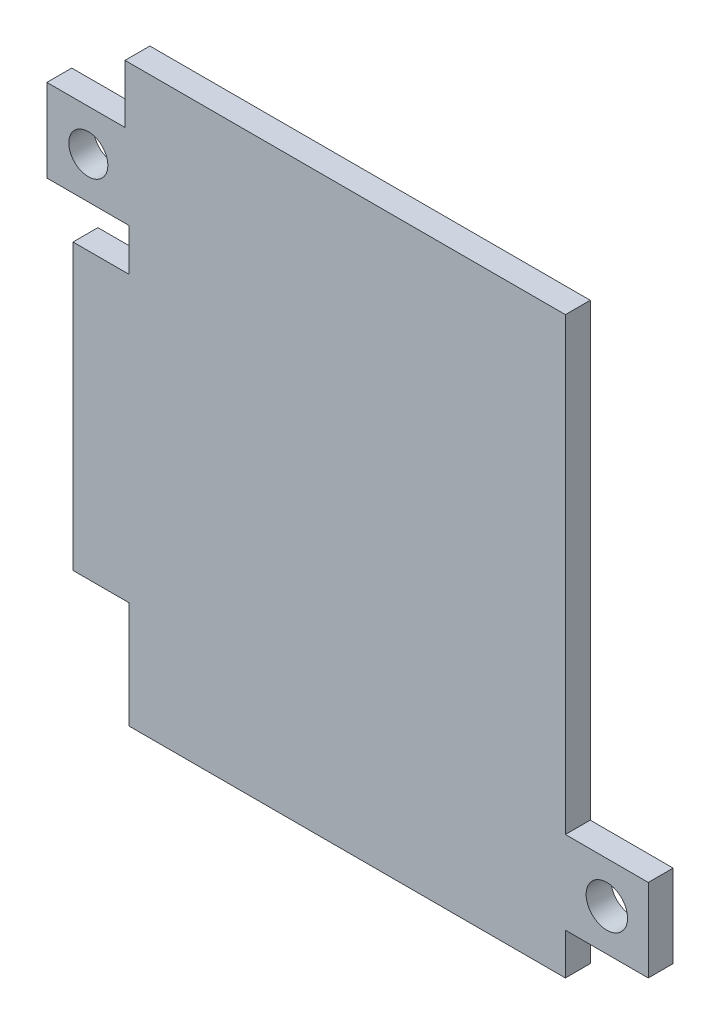
ISO-10303-21;
HEADER;
FILE_DESCRIPTION(('STEP AP214'),'2;1');
FILE_NAME('part.step','',(''),(''),'','','');
FILE_SCHEMA(('AUTOMOTIVE_DESIGN { 1 0 10303 214 1 1 1 1 }'));
ENDSEC;
DATA;
#1=APPLICATION_CONTEXT('core data for automotive mechanical design processes');
#2=APPLICATION_PROTOCOL_DEFINITION('international standard','automotive_design',2000,#1);
#3=PRODUCT_CONTEXT('',#1,'mechanical');
#4=PRODUCT('Part','Part','',(#3));
#5=PRODUCT_RELATED_PRODUCT_CATEGORY('part','',(#4));
#6=PRODUCT_DEFINITION_FORMATION('','',#4);
#7=PRODUCT_DEFINITION_CONTEXT('part definition',#1,'design');
#8=PRODUCT_DEFINITION('design','',#6,#7);
#9=PRODUCT_DEFINITION_SHAPE('','',#8);
#10=(LENGTH_UNIT() NAMED_UNIT(*) SI_UNIT(.MILLI.,.METRE.));
#11=(NAMED_UNIT(*) PLANE_ANGLE_UNIT() SI_UNIT($,.RADIAN.));
#12=(NAMED_UNIT(*) SI_UNIT($,.STERADIAN.) SOLID_ANGLE_UNIT());
#13=UNCERTAINTY_MEASURE_WITH_UNIT(LENGTH_MEASURE(1.E-05),#10,'distance_accuracy_value','');
#14=(GEOMETRIC_REPRESENTATION_CONTEXT(3) GLOBAL_UNCERTAINTY_ASSIGNED_CONTEXT((#13)) GLOBAL_UNIT_ASSIGNED_CONTEXT((#10,
#11,#12)) REPRESENTATION_CONTEXT('',''));
#15=CARTESIAN_POINT('',(0.,0.,0.));
#16=DIRECTION('',(0.,0.,1.));
#17=DIRECTION('',(1.,0.,0.));
#18=AXIS2_PLACEMENT_3D('',#15,#16,#17);
#19=CARTESIAN_POINT('',(0.,0.,1.8));
#20=DIRECTION('',(0.,0.,-1.));
#21=DIRECTION('',(-1.,0.,0.));
#22=AXIS2_PLACEMENT_3D('',#19,#20,#21);
#23=PLANE('',#22);
#24=DIRECTION('',(1.,0.,0.));
#25=VECTOR('',#24,1.);
#26=CARTESIAN_POINT('',(-20.5506636767524,9.63959565408557,1.8));
#27=LINE('',#26,#25);
#28=CARTESIAN_POINT('',(-20.5506636767524,9.63959565408557,1.8));
#29=VERTEX_POINT('',#28);
#30=CARTESIAN_POINT('',(-14.6048323918041,9.63959565408557,1.8));
#31=VERTEX_POINT('',#30);
#32=EDGE_CURVE('E211',#29,#31,#27,.T.);
#33=ORIENTED_EDGE('',*,*,#32,.T.);
#34=DIRECTION('',(0.,-1.,0.));
#35=VECTOR('',#34,1.);
#36=CARTESIAN_POINT('',(-14.6048323918041,9.63959565408557,1.8));
#37=LINE('',#36,#35);
#38=CARTESIAN_POINT('',(-14.6048323918041,6.57746003419604,1.8));
#39=VERTEX_POINT('',#38);
#40=EDGE_CURVE('E119',#31,#39,#37,.T.);
#41=ORIENTED_EDGE('',*,*,#40,.T.);
#42=DIRECTION('',(-1.,0.,0.));
#43=VECTOR('',#42,1.);
#44=CARTESIAN_POINT('',(-14.6048323918041,6.57746003419604,1.8));
#45=LINE('',#44,#43);
#46=CARTESIAN_POINT('',(-18.6584036674937,6.57746003419604,1.8));
#47=VERTEX_POINT('',#46);
#48=EDGE_CURVE('E250',#39,#47,#45,.T.);
#49=ORIENTED_EDGE('',*,*,#48,.T.);
#50=DIRECTION('',(0.,-1.,0.));
#51=VECTOR('',#50,1.);
#52=CARTESIAN_POINT('',(-18.6584036674937,6.57746003419604,1.8));
#53=LINE('',#52,#51);
#54=CARTESIAN_POINT('',(-18.6584036674937,-14.0203381922736,1.8));
#55=VERTEX_POINT('',#54);
#56=EDGE_CURVE('E269',#47,#55,#53,.T.);
#57=ORIENTED_EDGE('',*,*,#56,.T.);
#58=DIRECTION('',(1.,0.,0.));
#59=VECTOR('',#58,1.);
#60=CARTESIAN_POINT('',(-18.6584036674937,-14.0203381922736,1.8));
#61=LINE('',#60,#59);
#62=CARTESIAN_POINT('',(-14.6048323918041,-14.0203381922736,1.8));
#63=VERTEX_POINT('',#62);
#64=EDGE_CURVE('E266',#55,#63,#61,.T.);
#65=ORIENTED_EDGE('',*,*,#64,.T.);
#66=DIRECTION('',(0.,-1.,0.));
#67=VECTOR('',#66,1.);
#68=CARTESIAN_POINT('',(-14.6048323918041,-14.0203381922736,1.8));
#69=LINE('',#68,#67);
#70=CARTESIAN_POINT('',(-14.6048323918041,-21.7504043459144,1.8));
#71=VERTEX_POINT('',#70);
#72=EDGE_CURVE('E268',#63,#71,#69,.T.);
#73=ORIENTED_EDGE('',*,*,#72,.T.);
#74=DIRECTION('',(1.,0.,0.));
#75=VECTOR('',#74,1.);
#76=CARTESIAN_POINT('',(-14.6048323918041,-21.7504043459144,1.8));
#77=LINE('',#76,#75);
#78=CARTESIAN_POINT('',(16.9951676081959,-21.7504043459144,1.8));
#79=VERTEX_POINT('',#78);
#80=EDGE_CURVE('E271',#71,#79,#77,.T.);
#81=ORIENTED_EDGE('',*,*,#80,.T.);
#82=DIRECTION('',(0.,1.,0.));
#83=VECTOR('',#82,1.);
#84=CARTESIAN_POINT('',(16.9951676081959,-21.7504043459144,1.8));
#85=LINE('',#84,#83);
#86=CARTESIAN_POINT('',(16.9951676081959,-18.7504043459144,1.8));
#87=VERTEX_POINT('',#86);
#88=EDGE_CURVE('E277',#79,#87,#85,.T.);
#89=ORIENTED_EDGE('',*,*,#88,.T.);
#90=DIRECTION('',(1.,0.,0.));
#91=VECTOR('',#90,1.);
#92=CARTESIAN_POINT('',(16.9951676081959,-18.7504043459144,1.8));
#93=LINE('',#92,#91);
#94=CARTESIAN_POINT('',(22.9951676081959,-18.7504043459144,1.8));
#95=VERTEX_POINT('',#94);
#96=EDGE_CURVE('E279',#87,#95,#93,.T.);
#97=ORIENTED_EDGE('',*,*,#96,.T.);
#98=DIRECTION('',(0.,1.,0.));
#99=VECTOR('',#98,1.);
#100=CARTESIAN_POINT('',(22.9951676081959,-18.7504043459144,1.8));
#101=LINE('',#100,#99);
#102=CARTESIAN_POINT('',(22.9951676081959,-12.7570635432331,1.8));
#103=VERTEX_POINT('',#102);
#104=EDGE_CURVE('E281',#95,#103,#101,.T.);
#105=ORIENTED_EDGE('',*,*,#104,.T.);
#106=DIRECTION('',(-0.999999384099056,0.00110986553621373,0.));
#107=VECTOR('',#106,1.);
#108=CARTESIAN_POINT('',(22.9951676081959,-12.7570635432331,1.8));
#109=LINE('',#108,#107);
#110=CARTESIAN_POINT('',(16.9951676081959,-12.7504043459144,1.8));
#111=VERTEX_POINT('',#110);
#112=EDGE_CURVE('E283',#103,#111,#109,.T.);
#113=ORIENTED_EDGE('',*,*,#112,.T.);
#114=DIRECTION('',(0.,1.,0.));
#115=VECTOR('',#114,1.);
#116=CARTESIAN_POINT('',(16.9951676081959,-12.7504043459144,1.8));
#117=LINE('',#116,#115);
#118=CARTESIAN_POINT('',(16.9951676081959,19.8495956540856,1.8));
#119=VERTEX_POINT('',#118);
#120=EDGE_CURVE('E285',#111,#119,#117,.T.);
#121=ORIENTED_EDGE('',*,*,#120,.T.);
#122=DIRECTION('',(-1.,0.,0.));
#123=VECTOR('',#122,1.);
#124=CARTESIAN_POINT('',(16.9951676081959,19.8495956540856,1.8));
#125=LINE('',#124,#123);
#126=CARTESIAN_POINT('',(-14.8945177106737,19.8495956540856,1.8));
#127=VERTEX_POINT('',#126);
#128=EDGE_CURVE('E162',#119,#127,#125,.T.);
#129=ORIENTED_EDGE('',*,*,#128,.T.);
#130=DIRECTION('',(0.,-1.,0.));
#131=VECTOR('',#130,1.);
#132=CARTESIAN_POINT('',(-14.8945177106737,19.8495956540856,1.8));
#133=LINE('',#132,#131);
#134=CARTESIAN_POINT('',(-14.8945177106737,15.6395956540856,1.8));
#135=VERTEX_POINT('',#134);
#136=EDGE_CURVE('E156',#127,#135,#133,.T.);
#137=ORIENTED_EDGE('',*,*,#136,.T.);
#138=DIRECTION('',(-1.,0.,0.));
#139=VECTOR('',#138,1.);
#140=CARTESIAN_POINT('',(-14.8945177106737,15.6395956540856,1.8));
#141=LINE('',#140,#139);
#142=CARTESIAN_POINT('',(-20.5506636767524,15.6395956540856,1.8));
#143=VERTEX_POINT('',#142);
#144=EDGE_CURVE('E160',#135,#143,#141,.T.);
#145=ORIENTED_EDGE('',*,*,#144,.T.);
#146=DIRECTION('',(0.,-1.,0.));
#147=VECTOR('',#146,1.);
#148=CARTESIAN_POINT('',(-20.5506636767524,15.6395956540856,1.8));
#149=LINE('',#148,#147);
#150=EDGE_CURVE('E52',#143,#29,#149,.T.);
#151=ORIENTED_EDGE('',*,*,#150,.T.);
#152=EDGE_LOOP('',(#33,#41,#49,#57,#65,#73,#81,#89,#97,#105,#113,#121,#129,#137,#145,#151));
#153=FACE_BOUND('',#152,.T.);
#154=CARTESIAN_POINT('',(-17.5506636767524,12.6395956540856,1.8));
#155=DIRECTION('',(0.,0.,1.));
#156=DIRECTION('',(1.,0.,0.));
#157=AXIS2_PLACEMENT_3D('',#154,#155,#156);
#158=CIRCLE('',#157,1.41403649151966);
#159=CARTESIAN_POINT('',(-16.1366271852327,12.6395956540856,1.8));
#160=VERTEX_POINT('',#159);
#161=EDGE_CURVE('E184',#160,#160,#158,.T.);
#162=ORIENTED_EDGE('',*,*,#161,.F.);
#163=EDGE_LOOP('',(#162));
#164=FACE_BOUND('',#163,.T.);
#165=CARTESIAN_POINT('',(19.9951676081959,-15.7539008134237,1.8));
#166=DIRECTION('',(0.,0.,1.));
#167=DIRECTION('',(1.,0.,0.));
#168=AXIS2_PLACEMENT_3D('',#165,#166,#167);
#169=CIRCLE('',#168,1.5);
#170=CARTESIAN_POINT('',(21.4951676081959,-15.7539008134237,1.8));
#171=VERTEX_POINT('',#170);
#172=EDGE_CURVE('E326',#171,#171,#169,.T.);
#173=ORIENTED_EDGE('',*,*,#172,.F.);
#174=EDGE_LOOP('',(#173));
#175=FACE_BOUND('',#174,.T.);
#176=ADVANCED_FACE('F35',(#153,#164,#175),#23,.F.);
#177=CARTESIAN_POINT('',(0.,0.,0.));
#178=DIRECTION('',(0.,0.,-1.));
#179=DIRECTION('',(-1.,0.,0.));
#180=AXIS2_PLACEMENT_3D('',#177,#178,#179);
#181=PLANE('',#180);
#182=CARTESIAN_POINT('',(-17.5506636767524,12.6395956540856,0.));
#183=DIRECTION('',(0.,0.,1.));
#184=DIRECTION('',(1.,0.,0.));
#185=AXIS2_PLACEMENT_3D('',#182,#183,#184);
#186=CIRCLE('',#185,1.41403649151966);
#187=CARTESIAN_POINT('',(-16.1366271852327,12.6395956540856,0.));
#188=VERTEX_POINT('',#187);
#189=EDGE_CURVE('E331',#188,#188,#186,.T.);
#190=ORIENTED_EDGE('',*,*,#189,.T.);
#191=EDGE_LOOP('',(#190));
#192=FACE_BOUND('',#191,.T.);
#193=DIRECTION('',(1.,0.,0.));
#194=VECTOR('',#193,1.);
#195=CARTESIAN_POINT('',(-20.5506636767524,9.63959565408557,0.));
#196=LINE('',#195,#194);
#197=CARTESIAN_POINT('',(-20.5506636767524,9.63959565408557,0.));
#198=VERTEX_POINT('',#197);
#199=CARTESIAN_POINT('',(-14.6048323918041,9.63959565408557,0.));
#200=VERTEX_POINT('',#199);
#201=EDGE_CURVE('E180',#198,#200,#196,.T.);
#202=ORIENTED_EDGE('',*,*,#201,.F.);
#203=DIRECTION('',(0.,-1.,0.));
#204=VECTOR('',#203,1.);
#205=CARTESIAN_POINT('',(-20.5506636767524,15.6395956540856,0.));
#206=LINE('',#205,#204);
#207=CARTESIAN_POINT('',(-20.5506636767524,15.6395956540856,0.));
#208=VERTEX_POINT('',#207);
#209=EDGE_CURVE('E111',#208,#198,#206,.T.);
#210=ORIENTED_EDGE('',*,*,#209,.F.);
#211=DIRECTION('',(-1.,0.,0.));
#212=VECTOR('',#211,1.);
#213=CARTESIAN_POINT('',(-14.8945177106737,15.6395956540856,0.));
#214=LINE('',#213,#212);
#215=CARTESIAN_POINT('',(-14.8945177106737,15.6395956540856,0.));
#216=VERTEX_POINT('',#215);
#217=EDGE_CURVE('E105',#216,#208,#214,.T.);
#218=ORIENTED_EDGE('',*,*,#217,.F.);
#219=DIRECTION('',(0.,-1.,0.));
#220=VECTOR('',#219,1.);
#221=CARTESIAN_POINT('',(-14.8945177106737,19.8495956540856,0.));
#222=LINE('',#221,#220);
#223=CARTESIAN_POINT('',(-14.8945177106737,19.8495956540856,0.));
#224=VERTEX_POINT('',#223);
#225=EDGE_CURVE('E170',#224,#216,#222,.T.);
#226=ORIENTED_EDGE('',*,*,#225,.F.);
#227=DIRECTION('',(-1.,0.,0.));
#228=VECTOR('',#227,1.);
#229=CARTESIAN_POINT('',(16.9951676081959,19.8495956540856,0.));
#230=LINE('',#229,#228);
#231=CARTESIAN_POINT('',(16.9951676081959,19.8495956540856,0.));
#232=VERTEX_POINT('',#231);
#233=EDGE_CURVE('E206',#232,#224,#230,.T.);
#234=ORIENTED_EDGE('',*,*,#233,.F.);
#235=DIRECTION('',(0.,1.,0.));
#236=VECTOR('',#235,1.);
#237=CARTESIAN_POINT('',(16.9951676081959,-12.7504043459144,0.));
#238=LINE('',#237,#236);
#239=CARTESIAN_POINT('',(16.9951676081959,-12.7504043459144,0.));
#240=VERTEX_POINT('',#239);
#241=EDGE_CURVE('E204',#240,#232,#238,.T.);
#242=ORIENTED_EDGE('',*,*,#241,.F.);
#243=DIRECTION('',(-0.999999384099056,0.00110986553621373,0.));
#244=VECTOR('',#243,1.);
#245=CARTESIAN_POINT('',(22.9951676081959,-12.7570635432331,0.));
#246=LINE('',#245,#244);
#247=CARTESIAN_POINT('',(22.9951676081959,-12.7570635432331,0.));
#248=VERTEX_POINT('',#247);
#249=EDGE_CURVE('E202',#248,#240,#246,.T.);
#250=ORIENTED_EDGE('',*,*,#249,.F.);
#251=DIRECTION('',(0.,1.,0.));
#252=VECTOR('',#251,1.);
#253=CARTESIAN_POINT('',(22.9951676081959,-18.7504043459144,0.));
#254=LINE('',#253,#252);
#255=CARTESIAN_POINT('',(22.9951676081959,-18.7504043459144,0.));
#256=VERTEX_POINT('',#255);
#257=EDGE_CURVE('E200',#256,#248,#254,.T.);
#258=ORIENTED_EDGE('',*,*,#257,.F.);
#259=DIRECTION('',(1.,0.,0.));
#260=VECTOR('',#259,1.);
#261=CARTESIAN_POINT('',(16.9951676081959,-18.7504043459144,0.));
#262=LINE('',#261,#260);
#263=CARTESIAN_POINT('',(16.9951676081959,-18.7504043459144,0.));
#264=VERTEX_POINT('',#263);
#265=EDGE_CURVE('E198',#264,#256,#262,.T.);
#266=ORIENTED_EDGE('',*,*,#265,.F.);
#267=DIRECTION('',(0.,1.,0.));
#268=VECTOR('',#267,1.);
#269=CARTESIAN_POINT('',(16.9951676081959,-21.7504043459144,0.));
#270=LINE('',#269,#268);
#271=CARTESIAN_POINT('',(16.9951676081959,-21.7504043459144,0.));
#272=VERTEX_POINT('',#271);
#273=EDGE_CURVE('E196',#272,#264,#270,.T.);
#274=ORIENTED_EDGE('',*,*,#273,.F.);
#275=DIRECTION('',(1.,0.,0.));
#276=VECTOR('',#275,1.);
#277=CARTESIAN_POINT('',(-14.6048323918041,-21.7504043459144,0.));
#278=LINE('',#277,#276);
#279=CARTESIAN_POINT('',(-14.6048323918041,-21.7504043459144,0.));
#280=VERTEX_POINT('',#279);
#281=EDGE_CURVE('E194',#280,#272,#278,.T.);
#282=ORIENTED_EDGE('',*,*,#281,.F.);
#283=DIRECTION('',(0.,-1.,0.));
#284=VECTOR('',#283,1.);
#285=CARTESIAN_POINT('',(-14.6048323918041,-14.0203381922736,0.));
#286=LINE('',#285,#284);
#287=CARTESIAN_POINT('',(-14.6048323918041,-14.0203381922736,0.));
#288=VERTEX_POINT('',#287);
#289=EDGE_CURVE('E192',#288,#280,#286,.T.);
#290=ORIENTED_EDGE('',*,*,#289,.F.);
#291=DIRECTION('',(1.,0.,0.));
#292=VECTOR('',#291,1.);
#293=CARTESIAN_POINT('',(-18.6584036674937,-14.0203381922736,0.));
#294=LINE('',#293,#292);
#295=CARTESIAN_POINT('',(-18.6584036674937,-14.0203381922736,0.));
#296=VERTEX_POINT('',#295);
#297=EDGE_CURVE('E190',#296,#288,#294,.T.);
#298=ORIENTED_EDGE('',*,*,#297,.F.);
#299=DIRECTION('',(0.,-1.,0.));
#300=VECTOR('',#299,1.);
#301=CARTESIAN_POINT('',(-18.6584036674937,6.57746003419604,0.));
#302=LINE('',#301,#300);
#303=CARTESIAN_POINT('',(-18.6584036674937,6.57746003419604,0.));
#304=VERTEX_POINT('',#303);
#305=EDGE_CURVE('E188',#304,#296,#302,.T.);
#306=ORIENTED_EDGE('',*,*,#305,.F.);
#307=DIRECTION('',(-1.,0.,0.));
#308=VECTOR('',#307,1.);
#309=CARTESIAN_POINT('',(-14.6048323918041,6.57746003419604,0.));
#310=LINE('',#309,#308);
#311=CARTESIAN_POINT('',(-14.6048323918041,6.57746003419604,0.));
#312=VERTEX_POINT('',#311);
#313=EDGE_CURVE('E186',#312,#304,#310,.T.);
#314=ORIENTED_EDGE('',*,*,#313,.F.);
#315=DIRECTION('',(0.,-1.,0.));
#316=VECTOR('',#315,1.);
#317=CARTESIAN_POINT('',(-14.6048323918041,9.63959565408557,0.));
#318=LINE('',#317,#316);
#319=EDGE_CURVE('E183',#200,#312,#318,.T.);
#320=ORIENTED_EDGE('',*,*,#319,.F.);
#321=EDGE_LOOP('',(#202,#210,#218,#226,#234,#242,#250,#258,#266,#274,#282,#290,#298,#306,#314,#320));
#322=FACE_BOUND('',#321,.T.);
#323=CARTESIAN_POINT('',(19.9951676081959,-15.7539008134237,0.));
#324=DIRECTION('',(0.,0.,1.));
#325=DIRECTION('',(1.,0.,0.));
#326=AXIS2_PLACEMENT_3D('',#323,#324,#325);
#327=CIRCLE('',#326,1.5);
#328=CARTESIAN_POINT('',(21.4951676081959,-15.7539008134237,0.));
#329=VERTEX_POINT('',#328);
#330=EDGE_CURVE('E329',#329,#329,#327,.T.);
#331=ORIENTED_EDGE('',*,*,#330,.T.);
#332=EDGE_LOOP('',(#331));
#333=FACE_BOUND('',#332,.T.);
#334=ADVANCED_FACE('F254',(#192,#322,#333),#181,.T.);
#335=CARTESIAN_POINT('',(-20.5506636767524,9.63959565408557,1.8));
#336=DIRECTION('',(0.,1.,0.));
#337=DIRECTION('',(0.,0.,1.));
#338=AXIS2_PLACEMENT_3D('',#335,#336,#337);
#339=PLANE('',#338);
#340=ORIENTED_EDGE('',*,*,#201,.T.);
#341=DIRECTION('',(0.,0.,-1.));
#342=VECTOR('',#341,1.);
#343=CARTESIAN_POINT('',(-14.6048323918041,9.63959565408557,1.8));
#344=LINE('',#343,#342);
#345=EDGE_CURVE('E11',#31,#200,#344,.T.);
#346=ORIENTED_EDGE('',*,*,#345,.F.);
#347=ORIENTED_EDGE('',*,*,#32,.F.);
#348=DIRECTION('',(0.,0.,-1.));
#349=VECTOR('',#348,1.);
#350=CARTESIAN_POINT('',(-20.5506636767524,9.63959565408557,1.8));
#351=LINE('',#350,#349);
#352=EDGE_CURVE('E176',#29,#198,#351,.T.);
#353=ORIENTED_EDGE('',*,*,#352,.T.);
#354=EDGE_LOOP('',(#340,#346,#347,#353));
#355=FACE_BOUND('',#354,.T.);
#356=ADVANCED_FACE('F37',(#355),#339,.F.);
#357=CARTESIAN_POINT('',(-14.6048323918041,9.63959565408557,1.8));
#358=DIRECTION('',(1.,0.,0.));
#359=DIRECTION('',(0.,0.,-1.));
#360=AXIS2_PLACEMENT_3D('',#357,#358,#359);
#361=PLANE('',#360);
#362=ORIENTED_EDGE('',*,*,#319,.T.);
#363=DIRECTION('',(0.,0.,-1.));
#364=VECTOR('',#363,1.);
#365=CARTESIAN_POINT('',(-14.6048323918041,6.57746003419604,1.8));
#366=LINE('',#365,#364);
#367=EDGE_CURVE('E44',#39,#312,#366,.T.);
#368=ORIENTED_EDGE('',*,*,#367,.F.);
#369=ORIENTED_EDGE('',*,*,#40,.F.);
#370=ORIENTED_EDGE('',*,*,#345,.T.);
#371=EDGE_LOOP('',(#362,#368,#369,#370));
#372=FACE_BOUND('',#371,.T.);
#373=ADVANCED_FACE('F466',(#372),#361,.F.);
#374=CARTESIAN_POINT('',(-14.6048323918041,6.57746003419604,1.8));
#375=DIRECTION('',(0.,-1.,0.));
#376=DIRECTION('',(0.,0.,-1.));
#377=AXIS2_PLACEMENT_3D('',#374,#375,#376);
#378=PLANE('',#377);
#379=ORIENTED_EDGE('',*,*,#313,.T.);
#380=DIRECTION('',(0.,0.,-1.));
#381=VECTOR('',#380,1.);
#382=CARTESIAN_POINT('',(-18.6584036674937,6.57746003419604,1.8));
#383=LINE('',#382,#381);
#384=EDGE_CURVE('E242',#47,#304,#383,.T.);
#385=ORIENTED_EDGE('',*,*,#384,.F.);
#386=ORIENTED_EDGE('',*,*,#48,.F.);
#387=ORIENTED_EDGE('',*,*,#367,.T.);
#388=EDGE_LOOP('',(#379,#385,#386,#387));
#389=FACE_BOUND('',#388,.T.);
#390=ADVANCED_FACE('F248',(#389),#378,.F.);
#391=CARTESIAN_POINT('',(-18.6584036674937,6.57746003419604,1.8));
#392=DIRECTION('',(1.,0.,0.));
#393=DIRECTION('',(0.,0.,-1.));
#394=AXIS2_PLACEMENT_3D('',#391,#392,#393);
#395=PLANE('',#394);
#396=ORIENTED_EDGE('',*,*,#305,.T.);
#397=DIRECTION('',(0.,0.,-1.));
#398=VECTOR('',#397,1.);
#399=CARTESIAN_POINT('',(-18.6584036674937,-14.0203381922736,1.8));
#400=LINE('',#399,#398);
#401=EDGE_CURVE('E239',#55,#296,#400,.T.);
#402=ORIENTED_EDGE('',*,*,#401,.F.);
#403=ORIENTED_EDGE('',*,*,#56,.F.);
#404=ORIENTED_EDGE('',*,*,#384,.T.);
#405=EDGE_LOOP('',(#396,#402,#403,#404));
#406=FACE_BOUND('',#405,.T.);
#407=ADVANCED_FACE('F260',(#406),#395,.F.);
#408=CARTESIAN_POINT('',(-18.6584036674937,-14.0203381922736,1.8));
#409=DIRECTION('',(0.,1.,0.));
#410=DIRECTION('',(0.,0.,1.));
#411=AXIS2_PLACEMENT_3D('',#408,#409,#410);
#412=PLANE('',#411);
#413=ORIENTED_EDGE('',*,*,#297,.T.);
#414=DIRECTION('',(0.,0.,-1.));
#415=VECTOR('',#414,1.);
#416=CARTESIAN_POINT('',(-14.6048323918041,-14.0203381922736,1.8));
#417=LINE('',#416,#415);
#418=EDGE_CURVE('E236',#63,#288,#417,.T.);
#419=ORIENTED_EDGE('',*,*,#418,.F.);
#420=ORIENTED_EDGE('',*,*,#64,.F.);
#421=ORIENTED_EDGE('',*,*,#401,.T.);
#422=EDGE_LOOP('',(#413,#419,#420,#421));
#423=FACE_BOUND('',#422,.T.);
#424=ADVANCED_FACE('F264',(#423),#412,.F.);
#425=CARTESIAN_POINT('',(-14.6048323918041,-14.0203381922736,1.8));
#426=DIRECTION('',(1.,0.,0.));
#427=DIRECTION('',(0.,0.,-1.));
#428=AXIS2_PLACEMENT_3D('',#425,#426,#427);
#429=PLANE('',#428);
#430=ORIENTED_EDGE('',*,*,#289,.T.);
#431=DIRECTION('',(0.,0.,-1.));
#432=VECTOR('',#431,1.);
#433=CARTESIAN_POINT('',(-14.6048323918041,-21.7504043459144,1.8));
#434=LINE('',#433,#432);
#435=EDGE_CURVE('E233',#71,#280,#434,.T.);
#436=ORIENTED_EDGE('',*,*,#435,.F.);
#437=ORIENTED_EDGE('',*,*,#72,.F.);
#438=ORIENTED_EDGE('',*,*,#418,.T.);
#439=EDGE_LOOP('',(#430,#436,#437,#438));
#440=FACE_BOUND('',#439,.T.);
#441=ADVANCED_FACE('F431',(#440),#429,.F.);
#442=CARTESIAN_POINT('',(-14.6048323918041,-21.7504043459144,1.8));
#443=DIRECTION('',(0.,1.,0.));
#444=DIRECTION('',(-1.,0.,0.));
#445=AXIS2_PLACEMENT_3D('',#442,#443,#444);
#446=PLANE('',#445);
#447=ORIENTED_EDGE('',*,*,#281,.T.);
#448=DIRECTION('',(0.,0.,-1.));
#449=VECTOR('',#448,1.);
#450=CARTESIAN_POINT('',(16.9951676081959,-21.7504043459144,1.8));
#451=LINE('',#450,#449);
#452=EDGE_CURVE('E230',#79,#272,#451,.T.);
#453=ORIENTED_EDGE('',*,*,#452,.F.);
#454=ORIENTED_EDGE('',*,*,#80,.F.);
#455=ORIENTED_EDGE('',*,*,#435,.T.);
#456=EDGE_LOOP('',(#447,#453,#454,#455));
#457=FACE_BOUND('',#456,.T.);
#458=ADVANCED_FACE('F421',(#457),#446,.F.);
#459=CARTESIAN_POINT('',(16.9951676081959,-21.7504043459144,1.8));
#460=DIRECTION('',(-1.,0.,0.));
#461=DIRECTION('',(0.,0.,1.));
#462=AXIS2_PLACEMENT_3D('',#459,#460,#461);
#463=PLANE('',#462);
#464=ORIENTED_EDGE('',*,*,#273,.T.);
#465=DIRECTION('',(0.,0.,-1.));
#466=VECTOR('',#465,1.);
#467=CARTESIAN_POINT('',(16.9951676081959,-18.7504043459144,1.8));
#468=LINE('',#467,#466);
#469=EDGE_CURVE('E227',#87,#264,#468,.T.);
#470=ORIENTED_EDGE('',*,*,#469,.F.);
#471=ORIENTED_EDGE('',*,*,#88,.F.);
#472=ORIENTED_EDGE('',*,*,#452,.T.);
#473=EDGE_LOOP('',(#464,#470,#471,#472));
#474=FACE_BOUND('',#473,.T.);
#475=ADVANCED_FACE('F411',(#474),#463,.F.);
#476=CARTESIAN_POINT('',(16.9951676081959,-18.7504043459144,1.8));
#477=DIRECTION('',(0.,1.,0.));
#478=DIRECTION('',(-1.,0.,0.));
#479=AXIS2_PLACEMENT_3D('',#476,#477,#478);
#480=PLANE('',#479);
#481=ORIENTED_EDGE('',*,*,#265,.T.);
#482=DIRECTION('',(0.,0.,-1.));
#483=VECTOR('',#482,1.);
#484=CARTESIAN_POINT('',(22.9951676081959,-18.7504043459144,1.8));
#485=LINE('',#484,#483);
#486=EDGE_CURVE('E224',#95,#256,#485,.T.);
#487=ORIENTED_EDGE('',*,*,#486,.F.);
#488=ORIENTED_EDGE('',*,*,#96,.F.);
#489=ORIENTED_EDGE('',*,*,#469,.T.);
#490=EDGE_LOOP('',(#481,#487,#488,#489));
#491=FACE_BOUND('',#490,.T.);
#492=ADVANCED_FACE('F401',(#491),#480,.F.);
#493=CARTESIAN_POINT('',(22.9951676081959,-18.7504043459144,1.8));
#494=DIRECTION('',(-1.,0.,0.));
#495=DIRECTION('',(0.,0.,1.));
#496=AXIS2_PLACEMENT_3D('',#493,#494,#495);
#497=PLANE('',#496);
#498=ORIENTED_EDGE('',*,*,#257,.T.);
#499=DIRECTION('',(0.,0.,-1.));
#500=VECTOR('',#499,1.);
#501=CARTESIAN_POINT('',(22.9951676081959,-12.7570635432331,1.8));
#502=LINE('',#501,#500);
#503=EDGE_CURVE('E221',#103,#248,#502,.T.);
#504=ORIENTED_EDGE('',*,*,#503,.F.);
#505=ORIENTED_EDGE('',*,*,#104,.F.);
#506=ORIENTED_EDGE('',*,*,#486,.T.);
#507=EDGE_LOOP('',(#498,#504,#505,#506));
#508=FACE_BOUND('',#507,.T.);
#509=ADVANCED_FACE('F391',(#508),#497,.F.);
#510=CARTESIAN_POINT('',(22.9951676081959,-12.7570635432331,1.8));
#511=DIRECTION('',(-0.00110986553621373,-0.999999384099056,0.));
#512=DIRECTION('',(0.999999384099056,-0.00110986553621373,0.));
#513=AXIS2_PLACEMENT_3D('',#510,#511,#512);
#514=PLANE('',#513);
#515=ORIENTED_EDGE('',*,*,#249,.T.);
#516=DIRECTION('',(0.,0.,-1.));
#517=VECTOR('',#516,1.);
#518=CARTESIAN_POINT('',(16.9951676081959,-12.7504043459144,1.8));
#519=LINE('',#518,#517);
#520=EDGE_CURVE('E218',#111,#240,#519,.T.);
#521=ORIENTED_EDGE('',*,*,#520,.F.);
#522=ORIENTED_EDGE('',*,*,#112,.F.);
#523=ORIENTED_EDGE('',*,*,#503,.T.);
#524=EDGE_LOOP('',(#515,#521,#522,#523));
#525=FACE_BOUND('',#524,.T.);
#526=ADVANCED_FACE('F382',(#525),#514,.F.);
#527=CARTESIAN_POINT('',(16.9951676081959,-12.7504043459144,1.8));
#528=DIRECTION('',(-1.,0.,0.));
#529=DIRECTION('',(0.,0.,1.));
#530=AXIS2_PLACEMENT_3D('',#527,#528,#529);
#531=PLANE('',#530);
#532=ORIENTED_EDGE('',*,*,#241,.T.);
#533=DIRECTION('',(0.,0.,-1.));
#534=VECTOR('',#533,1.);
#535=CARTESIAN_POINT('',(16.9951676081959,19.8495956540856,1.8));
#536=LINE('',#535,#534);
#537=EDGE_CURVE('E215',#119,#232,#536,.T.);
#538=ORIENTED_EDGE('',*,*,#537,.F.);
#539=ORIENTED_EDGE('',*,*,#120,.F.);
#540=ORIENTED_EDGE('',*,*,#520,.T.);
#541=EDGE_LOOP('',(#532,#538,#539,#540));
#542=FACE_BOUND('',#541,.T.);
#543=ADVANCED_FACE('F291',(#542),#531,.F.);
#544=CARTESIAN_POINT('',(16.9951676081959,19.8495956540856,1.8));
#545=DIRECTION('',(0.,-1.,0.));
#546=DIRECTION('',(0.,0.,-1.));
#547=AXIS2_PLACEMENT_3D('',#544,#545,#546);
#548=PLANE('',#547);
#549=ORIENTED_EDGE('',*,*,#233,.T.);
#550=DIRECTION('',(0.,0.,-1.));
#551=VECTOR('',#550,1.);
#552=CARTESIAN_POINT('',(-14.8945177106737,19.8495956540856,1.8));
#553=LINE('',#552,#551);
#554=EDGE_CURVE('E171',#127,#224,#553,.T.);
#555=ORIENTED_EDGE('',*,*,#554,.F.);
#556=ORIENTED_EDGE('',*,*,#128,.F.);
#557=ORIENTED_EDGE('',*,*,#537,.T.);
#558=EDGE_LOOP('',(#549,#555,#556,#557));
#559=FACE_BOUND('',#558,.T.);
#560=ADVANCED_FACE('F295',(#559),#548,.F.);
#561=CARTESIAN_POINT('',(-14.8945177106737,19.8495956540856,1.8));
#562=DIRECTION('',(1.,0.,0.));
#563=DIRECTION('',(0.,0.,-1.));
#564=AXIS2_PLACEMENT_3D('',#561,#562,#563);
#565=PLANE('',#564);
#566=ORIENTED_EDGE('',*,*,#225,.T.);
#567=DIRECTION('',(0.,0.,-1.));
#568=VECTOR('',#567,1.);
#569=CARTESIAN_POINT('',(-14.8945177106737,15.6395956540856,1.8));
#570=LINE('',#569,#568);
#571=EDGE_CURVE('E167',#135,#216,#570,.T.);
#572=ORIENTED_EDGE('',*,*,#571,.F.);
#573=ORIENTED_EDGE('',*,*,#136,.F.);
#574=ORIENTED_EDGE('',*,*,#554,.T.);
#575=EDGE_LOOP('',(#566,#572,#573,#574));
#576=FACE_BOUND('',#575,.T.);
#577=ADVANCED_FACE('F168',(#576),#565,.F.);
#578=CARTESIAN_POINT('',(-14.8945177106737,15.6395956540856,1.8));
#579=DIRECTION('',(0.,-1.,0.));
#580=DIRECTION('',(0.,0.,-1.));
#581=AXIS2_PLACEMENT_3D('',#578,#579,#580);
#582=PLANE('',#581);
#583=ORIENTED_EDGE('',*,*,#217,.T.);
#584=DIRECTION('',(0.,0.,-1.));
#585=VECTOR('',#584,1.);
#586=CARTESIAN_POINT('',(-20.5506636767524,15.6395956540856,1.8));
#587=LINE('',#586,#585);
#588=EDGE_CURVE('E172',#143,#208,#587,.T.);
#589=ORIENTED_EDGE('',*,*,#588,.F.);
#590=ORIENTED_EDGE('',*,*,#144,.F.);
#591=ORIENTED_EDGE('',*,*,#571,.T.);
#592=EDGE_LOOP('',(#583,#589,#590,#591));
#593=FACE_BOUND('',#592,.T.);
#594=ADVANCED_FACE('F174',(#593),#582,.F.);
#595=CARTESIAN_POINT('',(-20.5506636767524,15.6395956540856,1.8));
#596=DIRECTION('',(1.,0.,0.));
#597=DIRECTION('',(0.,0.,-1.));
#598=AXIS2_PLACEMENT_3D('',#595,#596,#597);
#599=PLANE('',#598);
#600=ORIENTED_EDGE('',*,*,#209,.T.);
#601=ORIENTED_EDGE('',*,*,#352,.F.);
#602=ORIENTED_EDGE('',*,*,#150,.F.);
#603=ORIENTED_EDGE('',*,*,#588,.T.);
#604=EDGE_LOOP('',(#600,#601,#602,#603));
#605=FACE_BOUND('',#604,.T.);
#606=ADVANCED_FACE('F299',(#605),#599,.F.);
#607=CARTESIAN_POINT('',(-17.5506636767524,12.6395956540856,1.8));
#608=DIRECTION('',(0.,0.,-1.));
#609=DIRECTION('',(-1.,0.,0.));
#610=AXIS2_PLACEMENT_3D('',#607,#608,#609);
#611=CYLINDRICAL_SURFACE('',#610,1.41403649151966);
#612=ORIENTED_EDGE('',*,*,#161,.T.);
#613=EDGE_LOOP('',(#612));
#614=FACE_BOUND('',#613,.T.);
#615=ORIENTED_EDGE('',*,*,#189,.F.);
#616=EDGE_LOOP('',(#615));
#617=FACE_BOUND('',#616,.T.);
#618=ADVANCED_FACE('F301',(#614,#617),#611,.F.);
#619=CARTESIAN_POINT('',(19.9951676081959,-15.7539008134237,1.8));
#620=DIRECTION('',(0.,0.,-1.));
#621=DIRECTION('',(-1.,0.,0.));
#622=AXIS2_PLACEMENT_3D('',#619,#620,#621);
#623=CYLINDRICAL_SURFACE('',#622,1.5);
#624=ORIENTED_EDGE('',*,*,#172,.T.);
#625=EDGE_LOOP('',(#624));
#626=FACE_BOUND('',#625,.T.);
#627=ORIENTED_EDGE('',*,*,#330,.F.);
#628=EDGE_LOOP('',(#627));
#629=FACE_BOUND('',#628,.T.);
#630=ADVANCED_FACE('F307',(#626,#629),#623,.F.);
#631=CLOSED_SHELL('',(#176,#334,#356,#373,#390,#407,#424,#441,#458,#475,#492,#509,#526,#543,
#560,#577,#594,#606,#618,#630));
#632=MANIFOLD_SOLID_BREP('B2',#631);
#633=ADVANCED_BREP_SHAPE_REPRESENTATION('',(#18,#632),#14);
#634=SHAPE_DEFINITION_REPRESENTATION(#9,#633);
ENDSEC;
END-ISO-10303-21;
